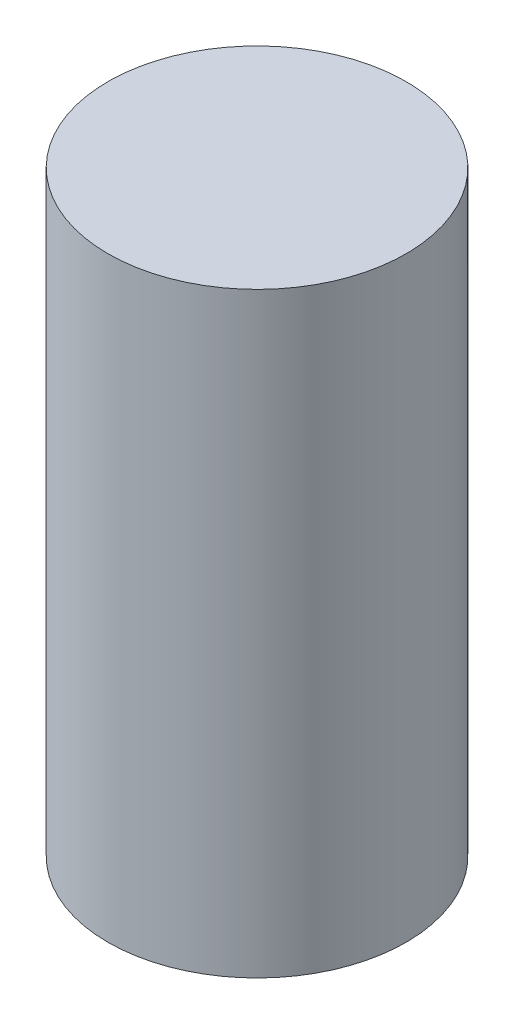
ISO-10303-21;
HEADER;
FILE_DESCRIPTION(('STEP AP214'),'2;1');
FILE_NAME('part.step','',(''),(''),'','','');
FILE_SCHEMA(('AUTOMOTIVE_DESIGN { 1 0 10303 214 1 1 1 1 }'));
ENDSEC;
DATA;
#1=APPLICATION_CONTEXT('core data for automotive mechanical design processes');
#2=APPLICATION_PROTOCOL_DEFINITION('international standard','automotive_design',2000,#1);
#3=PRODUCT_CONTEXT('',#1,'mechanical');
#4=PRODUCT('Part','Part','',(#3));
#5=PRODUCT_RELATED_PRODUCT_CATEGORY('part','',(#4));
#6=PRODUCT_DEFINITION_FORMATION('','',#4);
#7=PRODUCT_DEFINITION_CONTEXT('part definition',#1,'design');
#8=PRODUCT_DEFINITION('design','',#6,#7);
#9=PRODUCT_DEFINITION_SHAPE('','',#8);
#10=(LENGTH_UNIT() NAMED_UNIT(*) SI_UNIT(.MILLI.,.METRE.));
#11=(NAMED_UNIT(*) PLANE_ANGLE_UNIT() SI_UNIT($,.RADIAN.));
#12=(NAMED_UNIT(*) SI_UNIT($,.STERADIAN.) SOLID_ANGLE_UNIT());
#13=UNCERTAINTY_MEASURE_WITH_UNIT(LENGTH_MEASURE(1.E-05),#10,'distance_accuracy_value','');
#14=(GEOMETRIC_REPRESENTATION_CONTEXT(3) GLOBAL_UNCERTAINTY_ASSIGNED_CONTEXT((#13)) GLOBAL_UNIT_ASSIGNED_CONTEXT((#10,
#11,#12)) REPRESENTATION_CONTEXT('',''));
#15=CARTESIAN_POINT('',(0.,0.,0.));
#16=DIRECTION('',(0.,0.,1.));
#17=DIRECTION('',(1.,0.,0.));
#18=AXIS2_PLACEMENT_3D('',#15,#16,#17);
#19=CARTESIAN_POINT('',(0.,101.6,0.));
#20=DIRECTION('',(0.,-1.,0.));
#21=DIRECTION('',(0.,0.,-1.));
#22=AXIS2_PLACEMENT_3D('',#19,#20,#21);
#23=CYLINDRICAL_SURFACE('',#22,25.4);
#24=CARTESIAN_POINT('',(0.,101.6,0.));
#25=DIRECTION('',(0.,1.,0.));
#26=DIRECTION('',(0.,0.,1.));
#27=AXIS2_PLACEMENT_3D('',#24,#25,#26);
#28=CIRCLE('',#27,25.4);
#29=CARTESIAN_POINT('',(0.,101.6,25.4));
#30=VERTEX_POINT('',#29);
#31=EDGE_CURVE('E10',#30,#30,#28,.T.);
#32=ORIENTED_EDGE('',*,*,#31,.F.);
#33=EDGE_LOOP('',(#32));
#34=FACE_BOUND('',#33,.T.);
#35=CARTESIAN_POINT('',(0.,0.,0.));
#36=DIRECTION('',(0.,1.,0.));
#37=DIRECTION('',(0.,0.,1.));
#38=AXIS2_PLACEMENT_3D('',#35,#36,#37);
#39=CIRCLE('',#38,25.4);
#40=CARTESIAN_POINT('',(0.,0.,25.4));
#41=VERTEX_POINT('',#40);
#42=EDGE_CURVE('E40',#41,#41,#39,.T.);
#43=ORIENTED_EDGE('',*,*,#42,.T.);
#44=EDGE_LOOP('',(#43));
#45=FACE_BOUND('',#44,.T.);
#46=ADVANCED_FACE('F37',(#34,#45),#23,.T.);
#47=CARTESIAN_POINT('',(0.,101.6,0.));
#48=DIRECTION('',(0.,1.,0.));
#49=DIRECTION('',(0.,0.,1.));
#50=AXIS2_PLACEMENT_3D('',#47,#48,#49);
#51=PLANE('',#50);
#52=ORIENTED_EDGE('',*,*,#31,.T.);
#53=EDGE_LOOP('',(#52));
#54=FACE_BOUND('',#53,.T.);
#55=ADVANCED_FACE('F52',(#54),#51,.T.);
#56=CARTESIAN_POINT('',(0.,0.,0.));
#57=DIRECTION('',(0.,1.,0.));
#58=DIRECTION('',(0.,0.,1.));
#59=AXIS2_PLACEMENT_3D('',#56,#57,#58);
#60=PLANE('',#59);
#61=ORIENTED_EDGE('',*,*,#42,.F.);
#62=EDGE_LOOP('',(#61));
#63=FACE_BOUND('',#62,.T.);
#64=ADVANCED_FACE('F50',(#63),#60,.F.);
#65=CLOSED_SHELL('',(#46,#55,#64));
#66=MANIFOLD_SOLID_BREP('B2',#65);
#67=ADVANCED_BREP_SHAPE_REPRESENTATION('',(#18,#66),#14);
#68=SHAPE_DEFINITION_REPRESENTATION(#9,#67);
ENDSEC;
END-ISO-10303-21;
